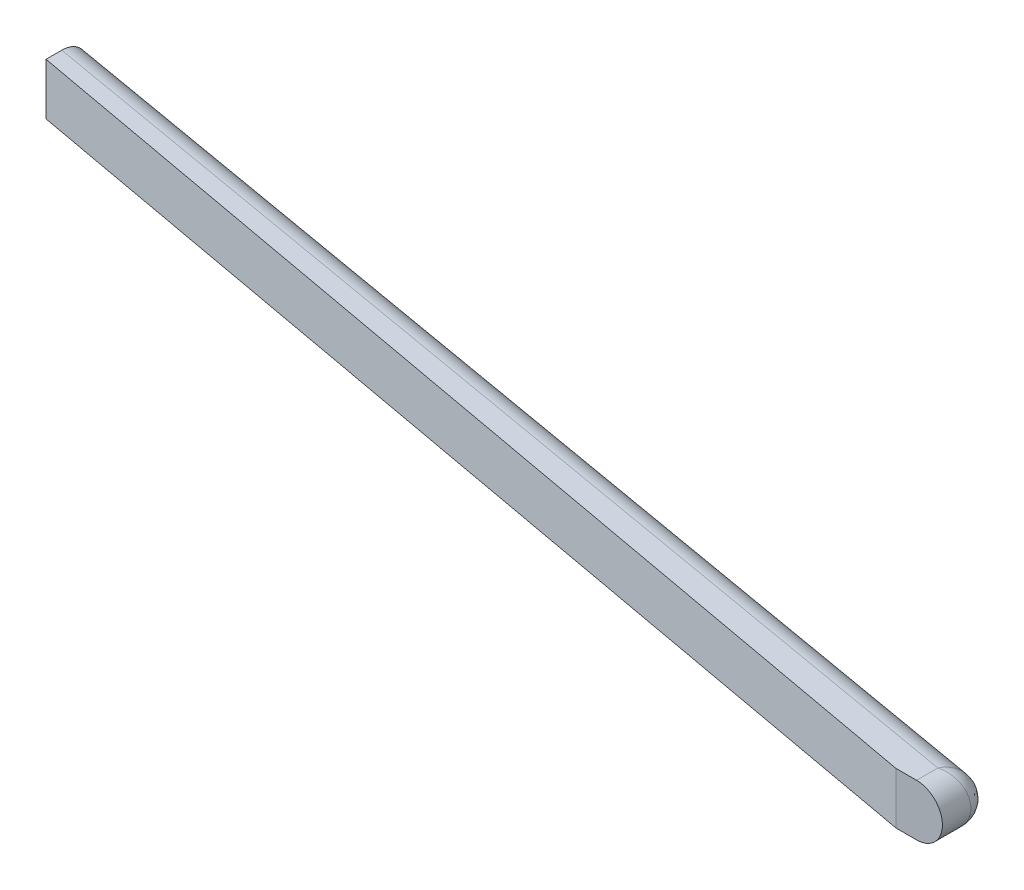
ISO-10303-21;
HEADER;
FILE_DESCRIPTION(('STEP AP214'),'2;1');
FILE_NAME('part.step','',(''),(''),'','','');
FILE_SCHEMA(('AUTOMOTIVE_DESIGN { 1 0 10303 214 1 1 1 1 }'));
ENDSEC;
DATA;
#1=APPLICATION_CONTEXT('core data for automotive mechanical design processes');
#2=APPLICATION_PROTOCOL_DEFINITION('international standard','automotive_design',2000,#1);
#3=PRODUCT_CONTEXT('',#1,'mechanical');
#4=PRODUCT('Part','Part','',(#3));
#5=PRODUCT_RELATED_PRODUCT_CATEGORY('part','',(#4));
#6=PRODUCT_DEFINITION_FORMATION('','',#4);
#7=PRODUCT_DEFINITION_CONTEXT('part definition',#1,'design');
#8=PRODUCT_DEFINITION('design','',#6,#7);
#9=PRODUCT_DEFINITION_SHAPE('','',#8);
#10=(LENGTH_UNIT() NAMED_UNIT(*) SI_UNIT(.MILLI.,.METRE.));
#11=(NAMED_UNIT(*) PLANE_ANGLE_UNIT() SI_UNIT($,.RADIAN.));
#12=(NAMED_UNIT(*) SI_UNIT($,.STERADIAN.) SOLID_ANGLE_UNIT());
#13=UNCERTAINTY_MEASURE_WITH_UNIT(LENGTH_MEASURE(1.E-05),#10,'distance_accuracy_value','');
#14=(GEOMETRIC_REPRESENTATION_CONTEXT(3) GLOBAL_UNCERTAINTY_ASSIGNED_CONTEXT((#13)) GLOBAL_UNIT_ASSIGNED_CONTEXT((#10,
#11,#12)) REPRESENTATION_CONTEXT('',''));
#15=CARTESIAN_POINT('',(0.,0.,0.));
#16=DIRECTION('',(0.,0.,1.));
#17=DIRECTION('',(1.,0.,0.));
#18=AXIS2_PLACEMENT_3D('',#15,#16,#17);
#19=CARTESIAN_POINT('',(23.6722556721648,-19.9472762561683,10.6958405202929));
#20=DIRECTION('',(1.,0.,0.));
#21=DIRECTION('',(0.,1.,0.));
#22=AXIS2_PLACEMENT_3D('',#19,#20,#21);
#23=PLANE('',#22);
#24=CARTESIAN_POINT('',(23.6722556721648,-11.9026560857858,11.3254920356123));
#25=DIRECTION('',(-1.,0.,0.));
#26=DIRECTION('',(0.,8.40894440800744E-12,1.));
#27=AXIS2_PLACEMENT_3D('',#24,#25,#26);
#28=ELLIPSE('',#27,0.304468250798645,0.300000000000084);
#29=CARTESIAN_POINT('',(23.6722556721648,-11.6026560857858,11.3254920356122));
#30=VERTEX_POINT('',#29);
#31=CARTESIAN_POINT('',(23.6722556721648,-12.2026560857858,11.3254920356122));
#32=VERTEX_POINT('',#31);
#33=EDGE_CURVE('E11',#30,#32,#28,.T.);
#34=ORIENTED_EDGE('',*,*,#33,.T.);
#35=DIRECTION('',(0.,0.,1.));
#36=VECTOR('',#35,1.);
#37=CARTESIAN_POINT('',(23.6722556721648,-12.2026560857858,11.3254920356122));
#38=LINE('',#37,#36);
#39=CARTESIAN_POINT('',(23.6722556721648,-12.2026560857858,11.5085053903895));
#40=VERTEX_POINT('',#39);
#41=EDGE_CURVE('E92',#32,#40,#38,.T.);
#42=ORIENTED_EDGE('',*,*,#41,.T.);
#43=DIRECTION('',(0.,-1.,0.));
#44=VECTOR('',#43,1.);
#45=CARTESIAN_POINT('',(23.6722556721648,-11.6026560857858,11.5085053903895));
#46=LINE('',#45,#44);
#47=CARTESIAN_POINT('',(23.6722556721648,-11.6026560857858,11.5085053903895));
#48=VERTEX_POINT('',#47);
#49=EDGE_CURVE('E93',#48,#40,#46,.T.);
#50=ORIENTED_EDGE('',*,*,#49,.F.);
#51=DIRECTION('',(0.,0.,1.));
#52=VECTOR('',#51,1.);
#53=CARTESIAN_POINT('',(23.6722556721648,-11.6026560857858,11.3254920356122));
#54=LINE('',#53,#52);
#55=EDGE_CURVE('E30',#30,#48,#54,.T.);
#56=ORIENTED_EDGE('',*,*,#55,.F.);
#57=EDGE_LOOP('',(#34,#42,#50,#56));
#58=FACE_BOUND('',#57,.T.);
#59=ADVANCED_FACE('F17',(#58),#23,.F.);
#60=CARTESIAN_POINT('',(36.0629307866719,-11.9026560857857,13.4719838338669));
#61=DIRECTION('',(0.985324411373474,0.,0.170692133244378));
#62=DIRECTION('',(0.170692133244378,0.,-0.985324411373474));
#63=AXIS2_PLACEMENT_3D('',#60,#61,#62);
#64=CYLINDRICAL_SURFACE('',#63,0.3);
#65=ORIENTED_EDGE('',*,*,#33,.F.);
#66=DIRECTION('',(-0.985324411373474,0.,-0.170692133244378));
#67=VECTOR('',#66,1.);
#68=CARTESIAN_POINT('',(35.9799999999964,-11.6026560857857,13.4576173645844));
#69=LINE('',#68,#67);
#70=CARTESIAN_POINT('',(35.9799999999964,-11.6026560857857,13.4576173645844));
#71=VERTEX_POINT('',#70);
#72=EDGE_CURVE('E98',#71,#30,#69,.T.);
#73=ORIENTED_EDGE('',*,*,#72,.F.);
#74=CARTESIAN_POINT('',(35.9799999999964,-12.2026560857857,13.4576173645844));
#75=CARTESIAN_POINT('',(36.0152157640466,-12.2026560857857,13.3837849838788));
#76=CARTESIAN_POINT('',(36.0500187748418,-12.1703234734031,13.3108179700452));
#77=CARTESIAN_POINT('',(36.087265899444,-12.0870204436056,13.232726695937));
#78=CARTESIAN_POINT('',(36.0972084330203,-12.0537412321341,13.2118814596127));
#79=CARTESIAN_POINT('',(36.1106470612221,-11.9811809989889,13.1837064096063));
#80=CARTESIAN_POINT('',(36.1141384269012,-11.941925339489,13.1763865104992));
#81=CARTESIAN_POINT('',(36.1141384269012,-11.8633868320824,13.1763865104992));
#82=CARTESIAN_POINT('',(36.1106470612221,-11.8241311725828,13.1837064096063));
#83=CARTESIAN_POINT('',(36.0972084330203,-11.7515709394372,13.2118814596127));
#84=CARTESIAN_POINT('',(36.087265899444,-11.718291727966,13.232726695937));
#85=CARTESIAN_POINT('',(36.0500187748418,-11.6349886981684,13.3108179700452));
#86=CARTESIAN_POINT('',(36.0152157640466,-11.6026560857857,13.3837849838788));
#87=CARTESIAN_POINT('',(35.9799999999964,-11.6026560857857,13.4576173645844));
#88=(BOUNDED_CURVE() B_SPLINE_CURVE(3,(#74,#75,#76,#77,#78,#79,#80,#81,#82,#83,#84,#85,#86,#87),
.UNSPECIFIED.,.F.,.F.) B_SPLINE_CURVE_WITH_KNOTS((4,2,2,2,2,2,4),(1.5707963267949,
2.35619449019235,2.74889357189107,3.1415926535898,3.53429173528852,3.92699081698725,
4.71238898038469),
.UNSPECIFIED.) CURVE() GEOMETRIC_REPRESENTATION_ITEM() RATIONAL_B_SPLINE_CURVE((1.,
1.00000000000461,0.999999999901722,0.99999999971724,0.999999999652316,0.99999999955599,
0.999999999526064,0.999999999526064,0.99999999955599,0.999999999652316,0.99999999971724,
0.999999999901722,1.00000000000461,1.)) REPRESENTATION_ITEM(''));
#89=CARTESIAN_POINT('',(35.9799999999964,-12.2026560857857,13.4576173645844));
#90=VERTEX_POINT('',#89);
#91=EDGE_CURVE('E130',#90,#71,#88,.T.);
#92=ORIENTED_EDGE('',*,*,#91,.F.);
#93=DIRECTION('',(0.985324411373474,0.,0.170692133244378));
#94=VECTOR('',#93,1.);
#95=CARTESIAN_POINT('',(23.6722556721648,-12.2026560857858,11.3254920356122));
#96=LINE('',#95,#94);
#97=EDGE_CURVE('E99',#32,#90,#96,.T.);
#98=ORIENTED_EDGE('',*,*,#97,.F.);
#99=EDGE_LOOP('',(#65,#73,#92,#98));
#100=FACE_BOUND('',#99,.T.);
#101=ADVANCED_FACE('F149',(#100),#64,.T.);
#102=CARTESIAN_POINT('',(36.0799999999964,-11.6026560857857,13.3734513927296));
#103=DIRECTION('',(0.,-1.,0.));
#104=DIRECTION('',(0.,0.,-1.));
#105=AXIS2_PLACEMENT_3D('',#102,#103,#104);
#106=PLANE('',#105);
#107=DIRECTION('',(1.,0.,0.));
#108=VECTOR('',#107,1.);
#109=CARTESIAN_POINT('',(35.7412195485883,-11.6026560857857,13.7051194490198));
#110=LINE('',#109,#108);
#111=CARTESIAN_POINT('',(35.7412195485883,-11.6026560857857,13.7051194490198));
#112=VERTEX_POINT('',#111);
#113=CARTESIAN_POINT('',(35.9799999999964,-11.6026560857857,13.7051194490198));
#114=VERTEX_POINT('',#113);
#115=EDGE_CURVE('E114',#112,#114,#110,.T.);
#116=ORIENTED_EDGE('',*,*,#115,.T.);
#117=DIRECTION('',(0.,0.,-1.));
#118=VECTOR('',#117,1.);
#119=CARTESIAN_POINT('',(35.9799999999964,-11.6026560857857,13.7051194490199));
#120=LINE('',#119,#118);
#121=EDGE_CURVE('E122',#114,#71,#120,.T.);
#122=ORIENTED_EDGE('',*,*,#121,.T.);
#123=ORIENTED_EDGE('',*,*,#72,.T.);
#124=ORIENTED_EDGE('',*,*,#55,.T.);
#125=DIRECTION('',(0.983837512572441,0.,0.179063533013489));
#126=VECTOR('',#125,1.);
#127=CARTESIAN_POINT('',(23.6722556721648,-11.6026560857858,11.5085053903895));
#128=LINE('',#127,#126);
#129=EDGE_CURVE('E101',#48,#112,#128,.T.);
#130=ORIENTED_EDGE('',*,*,#129,.T.);
#131=EDGE_LOOP('',(#116,#122,#123,#124,#130));
#132=FACE_BOUND('',#131,.T.);
#133=ADVANCED_FACE('F209',(#132),#106,.F.);
#134=CARTESIAN_POINT('',(36.0799999999964,-12.2026560857857,13.3734513927296));
#135=DIRECTION('',(0.,-1.,0.));
#136=DIRECTION('',(0.,0.,-1.));
#137=AXIS2_PLACEMENT_3D('',#134,#135,#136);
#138=PLANE('',#137);
#139=ORIENTED_EDGE('',*,*,#97,.T.);
#140=DIRECTION('',(0.,0.,1.));
#141=VECTOR('',#140,1.);
#142=CARTESIAN_POINT('',(35.9799999999964,-12.2026560857857,13.4576173645844));
#143=LINE('',#142,#141);
#144=CARTESIAN_POINT('',(35.9799999999964,-12.2026560857857,13.7051194490198));
#145=VERTEX_POINT('',#144);
#146=EDGE_CURVE('E121',#90,#145,#143,.T.);
#147=ORIENTED_EDGE('',*,*,#146,.T.);
#148=DIRECTION('',(1.,0.,0.));
#149=VECTOR('',#148,1.);
#150=CARTESIAN_POINT('',(35.7412195485883,-12.2026560857857,13.7051194490198));
#151=LINE('',#150,#149);
#152=CARTESIAN_POINT('',(35.7412195485883,-12.2026560857857,13.7051194490198));
#153=VERTEX_POINT('',#152);
#154=EDGE_CURVE('E77',#153,#145,#151,.T.);
#155=ORIENTED_EDGE('',*,*,#154,.F.);
#156=DIRECTION('',(0.983837512572441,0.,0.179063533013489));
#157=VECTOR('',#156,1.);
#158=CARTESIAN_POINT('',(23.6722556721648,-12.2026560857858,11.5085053903895));
#159=LINE('',#158,#157);
#160=EDGE_CURVE('E67',#40,#153,#159,.T.);
#161=ORIENTED_EDGE('',*,*,#160,.F.);
#162=ORIENTED_EDGE('',*,*,#41,.F.);
#163=EDGE_LOOP('',(#139,#147,#155,#161,#162));
#164=FACE_BOUND('',#163,.T.);
#165=ADVANCED_FACE('F104',(#164),#138,.T.);
#166=CARTESIAN_POINT('',(23.6722556721648,-11.6026560857858,11.5085053903895));
#167=DIRECTION('',(0.179063533013489,0.,-0.983837512572441));
#168=DIRECTION('',(0.,-1.,0.));
#169=AXIS2_PLACEMENT_3D('',#166,#167,#168);
#170=PLANE('',#169);
#171=ORIENTED_EDGE('',*,*,#160,.T.);
#172=DIRECTION('',(0.,-1.,0.));
#173=VECTOR('',#172,1.);
#174=CARTESIAN_POINT('',(35.7412195485883,-11.6026560857857,13.7051194490198));
#175=LINE('',#174,#173);
#176=EDGE_CURVE('E106',#112,#153,#175,.T.);
#177=ORIENTED_EDGE('',*,*,#176,.F.);
#178=ORIENTED_EDGE('',*,*,#129,.F.);
#179=ORIENTED_EDGE('',*,*,#49,.T.);
#180=EDGE_LOOP('',(#171,#177,#178,#179));
#181=FACE_BOUND('',#180,.T.);
#182=ADVANCED_FACE('F19',(#181),#170,.F.);
#183=CARTESIAN_POINT('',(17.2722556721648,-23.0226560857859,13.7051194490199));
#184=DIRECTION('',(0.,0.,-1.));
#185=DIRECTION('',(0.,-1.,0.));
#186=AXIS2_PLACEMENT_3D('',#183,#184,#185);
#187=PLANE('',#186);
#188=ORIENTED_EDGE('',*,*,#154,.T.);
#189=CARTESIAN_POINT('',(35.9799999999964,-11.9026560857857,13.7051194490198));
#190=DIRECTION('',(0.,0.,1.));
#191=DIRECTION('',(0.,-1.,0.));
#192=AXIS2_PLACEMENT_3D('',#189,#190,#191);
#193=CIRCLE('',#192,0.3);
#194=EDGE_CURVE('E118',#145,#114,#193,.T.);
#195=ORIENTED_EDGE('',*,*,#194,.T.);
#196=ORIENTED_EDGE('',*,*,#115,.F.);
#197=ORIENTED_EDGE('',*,*,#176,.T.);
#198=EDGE_LOOP('',(#188,#195,#196,#197));
#199=FACE_BOUND('',#198,.T.);
#200=ADVANCED_FACE('F160',(#199),#187,.F.);
#201=CARTESIAN_POINT('',(35.9799999999964,-11.9026560857857,13.3734513927296));
#202=DIRECTION('',(0.,0.,-1.));
#203=DIRECTION('',(1.,0.,0.));
#204=AXIS2_PLACEMENT_3D('',#201,#202,#203);
#205=CYLINDRICAL_SURFACE('',#204,0.3);
#206=ORIENTED_EDGE('',*,*,#121,.F.);
#207=ORIENTED_EDGE('',*,*,#194,.F.);
#208=ORIENTED_EDGE('',*,*,#146,.F.);
#209=CARTESIAN_POINT('',(35.9799999999964,-11.6026560857857,13.4576173645844));
#210=CARTESIAN_POINT('',(36.0587599009383,-11.6026560857858,13.4355210191584));
#211=CARTESIAN_POINT('',(36.1365966810457,-11.634988698163,13.413683658272));
#212=CARTESIAN_POINT('',(36.2198997108974,-11.718291727955,13.3903127233022));
#213=CARTESIAN_POINT('',(36.2421361433768,-11.7515709394259,13.3840742201111));
#214=CARTESIAN_POINT('',(36.2721915760599,-11.8241311725748,13.3756420710728));
#215=CARTESIAN_POINT('',(36.2799999999964,-11.8633868320783,13.3734513924321));
#216=CARTESIAN_POINT('',(36.2799999999964,-11.9419253394931,13.3734513924321));
#217=CARTESIAN_POINT('',(36.2721915760599,-11.9811809989966,13.3756420710728));
#218=CARTESIAN_POINT('',(36.2421361433768,-12.0537412321456,13.3840742201111));
#219=CARTESIAN_POINT('',(36.2198997108974,-12.0870204436167,13.3903127233022));
#220=CARTESIAN_POINT('',(36.1365966810457,-12.1703234734084,13.413683658272));
#221=CARTESIAN_POINT('',(36.0587599009383,-12.2026560857857,13.4355210191584));
#222=CARTESIAN_POINT('',(35.9799999999964,-12.2026560857857,13.4576173645844));
#223=(BOUNDED_CURVE() B_SPLINE_CURVE(3,(#209,#210,#211,#212,#213,#214,#215,#216,#217,#218,#219,
#220,#221,#222),.UNSPECIFIED.,.F.,.F.) B_SPLINE_CURVE_WITH_KNOTS((4,2,2,2,2,2,4),
(1.5707963267949,2.35619449019234,2.74889357189107,3.14159265358979,3.53429173528852,
3.92699081698724,4.71238898038469),
.UNSPECIFIED.) CURVE() GEOMETRIC_REPRESENTATION_ITEM() RATIONAL_B_SPLINE_CURVE((1.,
1.00000000000528,0.99999999988746,0.999999999676231,0.999999999601879,0.999999999491588,
0.999999999457317,0.999999999457317,0.999999999491588,0.999999999601879,0.999999999676231,
0.99999999988746,1.00000000000528,1.)) REPRESENTATION_ITEM(''));
#224=EDGE_CURVE('E172',#90,#71,#223,.F.);
#225=ORIENTED_EDGE('',*,*,#224,.T.);
#226=EDGE_LOOP('',(#206,#207,#208,#225));
#227=FACE_BOUND('',#226,.T.);
#228=ADVANCED_FACE('F148',(#227),#205,.T.);
#229=CARTESIAN_POINT('',(35.9799999999964,-11.6026560857857,13.4576173645844));
#230=CARTESIAN_POINT('',(35.9799999999964,-11.6026560857857,13.4576173645844));
#231=CARTESIAN_POINT('',(35.9799999999964,-11.6026560857857,13.4576173645844));
#232=CARTESIAN_POINT('',(36.0587806058375,-11.6026560857858,13.4355438020137));
#233=CARTESIAN_POINT('',(36.036003415896,-11.6026560857857,13.4104815453222));
#234=CARTESIAN_POINT('',(36.0151968497143,-11.6026560857857,13.3837606939921));
#235=CARTESIAN_POINT('',(36.1366292781188,-11.6350056555255,13.4137320965817));
#236=CARTESIAN_POINT('',(36.0988496056961,-11.6153414965296,13.3575864389054));
#237=CARTESIAN_POINT('',(36.0499766114743,-11.6350056555239,13.3107775833317));
#238=CARTESIAN_POINT('',(36.219925929829,-11.7183258023312,13.3903957044045));
#239=CARTESIAN_POINT('',(36.1863200278097,-11.6746057247212,13.2839661080507));
#240=CARTESIAN_POINT('',(36.0871886115357,-11.7183258023281,13.2326866975789));
#241=CARTESIAN_POINT('',(36.2421554103455,-11.7516061991428,13.3841684876164));
#242=CARTESIAN_POINT('',(36.2165118414035,-11.7046041456901,13.2585548747198));
#243=CARTESIAN_POINT('',(36.0971188377033,-11.7516061991395,13.2118463846911));
#244=CARTESIAN_POINT('',(36.2721969462751,-11.824155544194,13.3757535892568));
#245=CARTESIAN_POINT('',(36.264646603363,-11.7896763761342,13.2180417845179));
#246=CARTESIAN_POINT('',(36.1105380963317,-11.8241555441919,13.1836820829355));
#247=CARTESIAN_POINT('',(36.2799999658331,-11.8633997132464,13.3735682914152));
#248=CARTESIAN_POINT('',(36.2800984715339,-11.8448226571354,13.2050365695026));
#249=CARTESIAN_POINT('',(36.1140232376958,-11.8633997132452,13.1763665904326));
#250=CARTESIAN_POINT('',(36.2799999658331,-11.941912458325,13.3735682914152));
#251=CARTESIAN_POINT('',(36.2800984715339,-11.960489514436,13.2050365695026));
#252=CARTESIAN_POINT('',(36.1140232376958,-11.9419124583263,13.1763665904326));
#253=CARTESIAN_POINT('',(36.2721969462751,-11.9811566273774,13.3757535892568));
#254=CARTESIAN_POINT('',(36.264646603363,-12.0156357954373,13.2180417845179));
#255=CARTESIAN_POINT('',(36.1105380963317,-11.9811566273798,13.1836820829355));
#256=CARTESIAN_POINT('',(36.2421554103455,-12.0537059724287,13.3841684876164));
#257=CARTESIAN_POINT('',(36.2165118414035,-12.1007080258814,13.2585548747198));
#258=CARTESIAN_POINT('',(36.0971188377033,-12.0537059724318,13.2118463846911));
#259=CARTESIAN_POINT('',(36.219925929829,-12.0869863692404,13.3903957044045));
#260=CARTESIAN_POINT('',(36.1863200278097,-12.1307064468503,13.2839661080507));
#261=CARTESIAN_POINT('',(36.0871886115357,-12.0869863692435,13.2326866975789));
#262=CARTESIAN_POINT('',(36.1366292781188,-12.1703065160459,13.4137320965817));
#263=CARTESIAN_POINT('',(36.0988496056961,-12.189970675042,13.3575864389054));
#264=CARTESIAN_POINT('',(36.0499766114743,-12.1703065160476,13.3107775833317));
#265=CARTESIAN_POINT('',(36.0587806058375,-12.2026560857857,13.4355438020137));
#266=CARTESIAN_POINT('',(36.036003415896,-12.2026560857857,13.4104815453222));
#267=CARTESIAN_POINT('',(36.0151968497143,-12.2026560857857,13.3837606939921));
#268=CARTESIAN_POINT('',(35.9799999999964,-12.2026560857857,13.4576173645844));
#269=CARTESIAN_POINT('',(35.9799999999964,-12.2026560857857,13.4576173645844));
#270=CARTESIAN_POINT('',(35.9799999999964,-12.2026560857857,13.4576173645844));
#271=(BOUNDED_SURFACE() B_SPLINE_SURFACE(3,2,((#229,#230,#231),(#232,#233,#234),(#235,#236,
#237),(#238,#239,#240),(#241,#242,#243),(#244,#245,#246),(#247,#248,#249),(#250,#251,#252),
(#253,#254,#255),(#256,#257,#258),(#259,#260,#261),(#262,#263,#264),(#265,#266,#267),(#268,#269,
#270)),.UNSPECIFIED.,.F.,.F.,.F.) B_SPLINE_SURFACE_WITH_KNOTS((4,2,2,2,2,2,4),(3,3),
(1.5707963267949,2.35619449019234,2.74889357189107,3.14159265358979,3.53429173528852,
3.92699081698724,4.71238898038469),(-0.000453892581951907,1.00045389254005),
.UNSPECIFIED.) GEOMETRIC_REPRESENTATION_ITEM() RATIONAL_B_SPLINE_SURFACE(((1.,1.,1.),
(0.999997925444693,1.00228633099759,0.999997925444885),(1.00004424412153,0.95123933009719,
1.00004424411745),(1.00012729199438,0.85971372683889,1.00012729198262),(1.00015652038172,
0.82750163407122,1.00015652036727),(1.00019988299044,0.779712463972666,1.00019988297198),
(1.00021335448162,0.764865769947519,1.00021335446192),(1.00021335448162,0.764865769947519,
1.00021335446192),(1.00019988299044,0.779712463972691,1.00019988297198),(1.00015652038172,
0.827501634071202,1.00015652036727),(1.00012729199438,0.85971372683889,1.00012729198262),
(1.00004424412153,0.95123933009719,1.00004424411745),(0.999997925444693,1.00228633099759,
0.999997925444885),(1.,1.,1.))) REPRESENTATION_ITEM('') SURFACE());
#272=ORIENTED_EDGE('',*,*,#224,.F.);
#273=ORIENTED_EDGE('',*,*,#91,.T.);
#274=EDGE_LOOP('',(#272,#273));
#275=FACE_BOUND('',#274,.T.);
#276=ADVANCED_FACE('F136',(#275),#271,.T.);
#277=CLOSED_SHELL('',(#59,#101,#133,#165,#182,#200,#228,#276));
#278=MANIFOLD_SOLID_BREP('B1',#277);
#279=ADVANCED_BREP_SHAPE_REPRESENTATION('',(#18,#278),#14);
#280=SHAPE_DEFINITION_REPRESENTATION(#9,#279);
ENDSEC;
END-ISO-10303-21;
